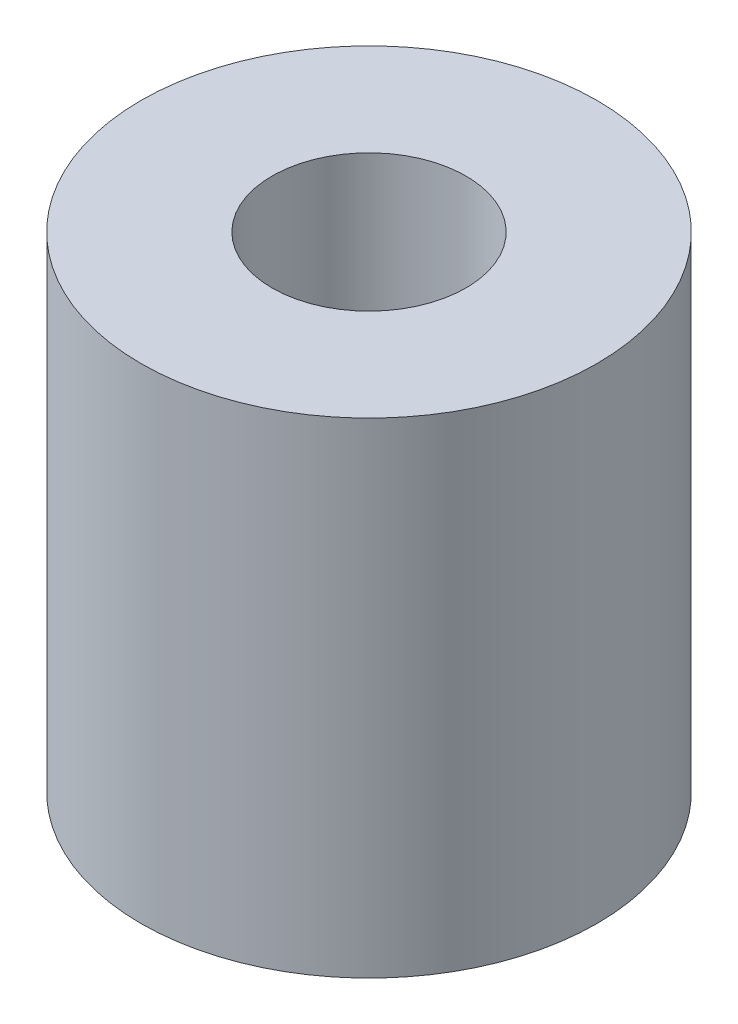
ISO-10303-21;
HEADER;
FILE_DESCRIPTION(('STEP AP214'),'2;1');
FILE_NAME('part.step','',(''),(''),'','','');
FILE_SCHEMA(('AUTOMOTIVE_DESIGN { 1 0 10303 214 1 1 1 1 }'));
ENDSEC;
DATA;
#1=APPLICATION_CONTEXT('core data for automotive mechanical design processes');
#2=APPLICATION_PROTOCOL_DEFINITION('international standard','automotive_design',2000,#1);
#3=PRODUCT_CONTEXT('',#1,'mechanical');
#4=PRODUCT('Part','Part','',(#3));
#5=PRODUCT_RELATED_PRODUCT_CATEGORY('part','',(#4));
#6=PRODUCT_DEFINITION_FORMATION('','',#4);
#7=PRODUCT_DEFINITION_CONTEXT('part definition',#1,'design');
#8=PRODUCT_DEFINITION('design','',#6,#7);
#9=PRODUCT_DEFINITION_SHAPE('','',#8);
#10=(LENGTH_UNIT() NAMED_UNIT(*) SI_UNIT(.MILLI.,.METRE.));
#11=(NAMED_UNIT(*) PLANE_ANGLE_UNIT() SI_UNIT($,.RADIAN.));
#12=(NAMED_UNIT(*) SI_UNIT($,.STERADIAN.) SOLID_ANGLE_UNIT());
#13=UNCERTAINTY_MEASURE_WITH_UNIT(LENGTH_MEASURE(1.E-05),#10,'distance_accuracy_value','');
#14=(GEOMETRIC_REPRESENTATION_CONTEXT(3) GLOBAL_UNCERTAINTY_ASSIGNED_CONTEXT((#13)) GLOBAL_UNIT_ASSIGNED_CONTEXT((#10,
#11,#12)) REPRESENTATION_CONTEXT('',''));
#15=CARTESIAN_POINT('',(0.,0.,0.));
#16=DIRECTION('',(0.,0.,1.));
#17=DIRECTION('',(1.,0.,0.));
#18=AXIS2_PLACEMENT_3D('',#15,#16,#17);
#19=CARTESIAN_POINT('',(0.,25.,0.));
#20=DIRECTION('',(0.,1.,0.));
#21=DIRECTION('',(0.,0.,1.));
#22=AXIS2_PLACEMENT_3D('',#19,#20,#21);
#23=PLANE('',#22);
#24=CARTESIAN_POINT('',(0.,25.,0.));
#25=DIRECTION('',(0.,1.,0.));
#26=DIRECTION('',(0.,0.,1.));
#27=AXIS2_PLACEMENT_3D('',#24,#25,#26);
#28=CIRCLE('',#27,11.75);
#29=CARTESIAN_POINT('',(0.,25.,11.75));
#30=VERTEX_POINT('',#29);
#31=EDGE_CURVE('E10',#30,#30,#28,.T.);
#32=ORIENTED_EDGE('',*,*,#31,.T.);
#33=EDGE_LOOP('',(#32));
#34=FACE_BOUND('',#33,.T.);
#35=CARTESIAN_POINT('',(0.,25.,0.));
#36=DIRECTION('',(0.,1.,0.));
#37=DIRECTION('',(0.,0.,1.));
#38=AXIS2_PLACEMENT_3D('',#35,#36,#37);
#39=CIRCLE('',#38,5.);
#40=CARTESIAN_POINT('',(0.,25.,5.));
#41=VERTEX_POINT('',#40);
#42=EDGE_CURVE('E50',#41,#41,#39,.T.);
#43=ORIENTED_EDGE('',*,*,#42,.F.);
#44=EDGE_LOOP('',(#43));
#45=FACE_BOUND('',#44,.T.);
#46=ADVANCED_FACE('F37',(#34,#45),#23,.T.);
#47=CARTESIAN_POINT('',(0.,0.,0.));
#48=DIRECTION('',(0.,1.,0.));
#49=DIRECTION('',(0.,0.,1.));
#50=AXIS2_PLACEMENT_3D('',#47,#48,#49);
#51=PLANE('',#50);
#52=CARTESIAN_POINT('',(0.,0.,0.));
#53=DIRECTION('',(0.,1.,0.));
#54=DIRECTION('',(0.,0.,1.));
#55=AXIS2_PLACEMENT_3D('',#52,#53,#54);
#56=CIRCLE('',#55,11.75);
#57=CARTESIAN_POINT('',(0.,0.,11.75));
#58=VERTEX_POINT('',#57);
#59=EDGE_CURVE('E41',#58,#58,#56,.T.);
#60=ORIENTED_EDGE('',*,*,#59,.F.);
#61=EDGE_LOOP('',(#60));
#62=FACE_BOUND('',#61,.T.);
#63=CARTESIAN_POINT('',(0.,0.,0.));
#64=DIRECTION('',(0.,1.,0.));
#65=DIRECTION('',(0.,0.,1.));
#66=AXIS2_PLACEMENT_3D('',#63,#64,#65);
#67=CIRCLE('',#66,5.);
#68=CARTESIAN_POINT('',(0.,0.,5.));
#69=VERTEX_POINT('',#68);
#70=EDGE_CURVE('E52',#69,#69,#67,.T.);
#71=ORIENTED_EDGE('',*,*,#70,.T.);
#72=EDGE_LOOP('',(#71));
#73=FACE_BOUND('',#72,.T.);
#74=ADVANCED_FACE('F64',(#62,#73),#51,.F.);
#75=CARTESIAN_POINT('',(0.,25.,0.));
#76=DIRECTION('',(0.,-1.,0.));
#77=DIRECTION('',(0.,0.,-1.));
#78=AXIS2_PLACEMENT_3D('',#75,#76,#77);
#79=CYLINDRICAL_SURFACE('',#78,11.75);
#80=ORIENTED_EDGE('',*,*,#31,.F.);
#81=EDGE_LOOP('',(#80));
#82=FACE_BOUND('',#81,.T.);
#83=ORIENTED_EDGE('',*,*,#59,.T.);
#84=EDGE_LOOP('',(#83));
#85=FACE_BOUND('',#84,.T.);
#86=ADVANCED_FACE('F39',(#82,#85),#79,.T.);
#87=CARTESIAN_POINT('',(0.,25.,0.));
#88=DIRECTION('',(0.,-1.,0.));
#89=DIRECTION('',(0.,0.,-1.));
#90=AXIS2_PLACEMENT_3D('',#87,#88,#89);
#91=CYLINDRICAL_SURFACE('',#90,5.);
#92=ORIENTED_EDGE('',*,*,#42,.T.);
#93=EDGE_LOOP('',(#92));
#94=FACE_BOUND('',#93,.T.);
#95=ORIENTED_EDGE('',*,*,#70,.F.);
#96=EDGE_LOOP('',(#95));
#97=FACE_BOUND('',#96,.T.);
#98=ADVANCED_FACE('F60',(#94,#97),#91,.F.);
#99=CLOSED_SHELL('',(#46,#74,#86,#98));
#100=MANIFOLD_SOLID_BREP('B2',#99);
#101=ADVANCED_BREP_SHAPE_REPRESENTATION('',(#18,#100),#14);
#102=SHAPE_DEFINITION_REPRESENTATION(#9,#101);
ENDSEC;
END-ISO-10303-21;
